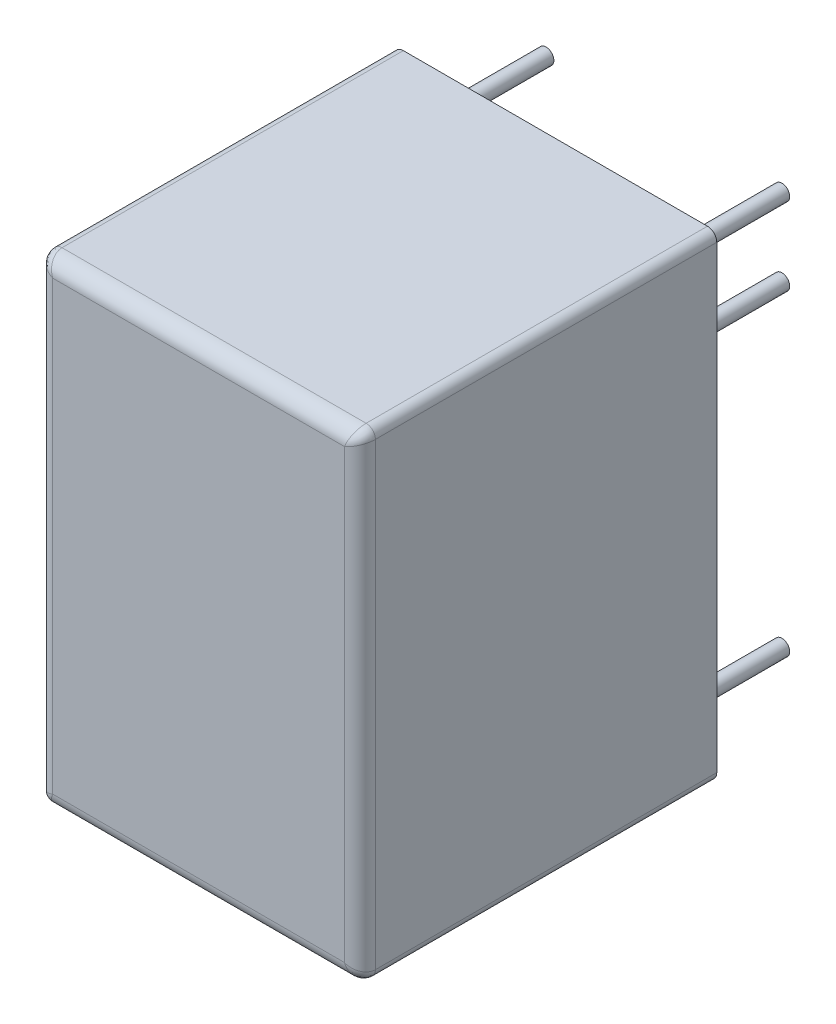
ISO-10303-21;
HEADER;
FILE_DESCRIPTION(('STEP AP214'),'2;1');
FILE_NAME('part.step','',(''),(''),'','','');
FILE_SCHEMA(('AUTOMOTIVE_DESIGN { 1 0 10303 214 1 1 1 1 }'));
ENDSEC;
DATA;
#1=APPLICATION_CONTEXT('core data for automotive mechanical design processes');
#2=APPLICATION_PROTOCOL_DEFINITION('international standard','automotive_design',2000,#1);
#3=PRODUCT_CONTEXT('',#1,'mechanical');
#4=PRODUCT('Part','Part','',(#3));
#5=PRODUCT_RELATED_PRODUCT_CATEGORY('part','',(#4));
#6=PRODUCT_DEFINITION_FORMATION('','',#4);
#7=PRODUCT_DEFINITION_CONTEXT('part definition',#1,'design');
#8=PRODUCT_DEFINITION('design','',#6,#7);
#9=PRODUCT_DEFINITION_SHAPE('','',#8);
#10=(LENGTH_UNIT() NAMED_UNIT(*) SI_UNIT(.MILLI.,.METRE.));
#11=(NAMED_UNIT(*) PLANE_ANGLE_UNIT() SI_UNIT($,.RADIAN.));
#12=(NAMED_UNIT(*) SI_UNIT($,.STERADIAN.) SOLID_ANGLE_UNIT());
#13=UNCERTAINTY_MEASURE_WITH_UNIT(LENGTH_MEASURE(1.E-05),#10,'distance_accuracy_value','');
#14=(GEOMETRIC_REPRESENTATION_CONTEXT(3) GLOBAL_UNCERTAINTY_ASSIGNED_CONTEXT((#13)) GLOBAL_UNIT_ASSIGNED_CONTEXT((#10,
#11,#12)) REPRESENTATION_CONTEXT('',''));
#15=CARTESIAN_POINT('',(0.,0.,0.));
#16=DIRECTION('',(0.,0.,1.));
#17=DIRECTION('',(1.,0.,0.));
#18=AXIS2_PLACEMENT_3D('',#15,#16,#17);
#19=CARTESIAN_POINT('',(27.3,56.6,18.1));
#20=CARTESIAN_POINT('',(27.3,56.6,18.1));
#21=CARTESIAN_POINT('',(27.3,56.6,18.1));
#22=CARTESIAN_POINT('',(27.1687328358683,56.5474931343472,18.1));
#23=CARTESIAN_POINT('',(27.2091570814848,56.5091570814838,18.1000000017816));
#24=CARTESIAN_POINT('',(27.2474931343475,56.468732835868,18.1));
#25=CARTESIAN_POINT('',(27.0390064135073,56.4956025654031,18.0461131946938));
#26=CARTESIAN_POINT('',(27.1079635319146,56.4079635319148,18.0810188700615));
#27=CARTESIAN_POINT('',(27.1956025654029,56.3390064135074,18.0461131946939));
#28=CARTESIAN_POINT('',(26.8538868053063,56.4215547221224,17.8609935864928));
#29=CARTESIAN_POINT('',(26.9089872650397,56.2089872650394,17.9566567342225));
#30=CARTESIAN_POINT('',(27.1215547221225,56.1538868053061,17.8609935864926));
#31=CARTESIAN_POINT('',(26.8,56.4000000016405,17.7312671641272));
#32=CARTESIAN_POINT('',(26.8000001226366,56.1000001226384,17.8292099083742));
#33=CARTESIAN_POINT('',(27.1000000016408,56.1,17.7312671641273));
#34=CARTESIAN_POINT('',(26.8,56.4,17.6));
#35=CARTESIAN_POINT('',(26.8,56.1,17.6));
#36=CARTESIAN_POINT('',(27.1,56.1,17.6));
#37=(BOUNDED_SURFACE() B_SPLINE_SURFACE(3,2,((#19,#20,#21),(#22,#23,#24),(#25,#26,#27),(#28,#29,
#30),(#31,#32,#33),(#34,#35,#36)),.UNSPECIFIED.,.F.,.F.,.F.) B_SPLINE_SURFACE_WITH_KNOTS((4,2,
4),(3,3),(0.,0.5,1.),(0.,1.),
.UNSPECIFIED.) GEOMETRIC_REPRESENTATION_ITEM() RATIONAL_B_SPLINE_SURFACE(((1.,1.,1.),(1.,
1.00267605951747,1.),(1.,0.941599607549783,1.),(1.,0.790451200019097,1.),(1.,0.704674357957136,
1.),(1.,0.707106781186548,1.))) REPRESENTATION_ITEM('') SURFACE());
#38=CARTESIAN_POINT('',(27.1,56.1,17.6));
#39=CARTESIAN_POINT('',(27.1000000016408,56.1,17.7312671641273));
#40=CARTESIAN_POINT('',(27.1215547221225,56.1538868053061,17.8609935864926));
#41=CARTESIAN_POINT('',(27.1956025654029,56.3390064135074,18.0461131946939));
#42=CARTESIAN_POINT('',(27.2474931343475,56.468732835868,18.1));
#43=CARTESIAN_POINT('',(27.3,56.6,18.1));
#44=(BOUNDED_CURVE() B_SPLINE_CURVE(3,(#38,#39,#40,#41,#42,#43),.UNSPECIFIED.,.F.,
.F.) B_SPLINE_CURVE_WITH_KNOTS((4,2,4),(0.,0.5,1.),
.UNSPECIFIED.) CURVE() GEOMETRIC_REPRESENTATION_ITEM() RATIONAL_B_SPLINE_CURVE((1.,1.,1.,1.,1.,1.)) REPRESENTATION_ITEM(''));
#45=CARTESIAN_POINT('',(27.3,56.6,18.1));
#46=VERTEX_POINT('',#45);
#47=CARTESIAN_POINT('',(27.1,56.1,17.6));
#48=VERTEX_POINT('',#47);
#49=EDGE_CURVE('E374',#46,#48,#44,.F.);
#50=CARTESIAN_POINT('',(27.3,56.6,18.1));
#51=CARTESIAN_POINT('',(27.1687328358683,56.5474931343472,18.1));
#52=CARTESIAN_POINT('',(27.0390064135073,56.4956025654031,18.0461131946938));
#53=CARTESIAN_POINT('',(26.8538868053063,56.4215547221224,17.8609935864928));
#54=CARTESIAN_POINT('',(26.8,56.4000000016405,17.7312671641272));
#55=CARTESIAN_POINT('',(26.8,56.4,17.6));
#56=(BOUNDED_CURVE() B_SPLINE_CURVE(3,(#50,#51,#52,#53,#54,#55),.UNSPECIFIED.,.F.,
.F.) B_SPLINE_CURVE_WITH_KNOTS((4,2,4),(0.,0.5,1.),
.UNSPECIFIED.) CURVE() GEOMETRIC_REPRESENTATION_ITEM() RATIONAL_B_SPLINE_CURVE((1.,1.,1.,1.,1.,1.)) REPRESENTATION_ITEM(''));
#57=CARTESIAN_POINT('',(26.8,56.4,17.6));
#58=VERTEX_POINT('',#57);
#59=EDGE_CURVE('E335',#58,#46,#56,.F.);
#60=CARTESIAN_POINT('',(27.1,56.4,17.6));
#61=DIRECTION('',(0.,0.,-1.));
#62=DIRECTION('',(-1.,0.,0.));
#63=AXIS2_PLACEMENT_3D('',#60,#61,#62);
#64=CIRCLE('',#63,0.3);
#65=EDGE_CURVE('E81',#48,#58,#64,.T.);
#66=ORIENTED_EDGE('',*,*,#49,.F.);
#67=ORIENTED_EDGE('',*,*,#59,.F.);
#68=ORIENTED_EDGE('',*,*,#65,.F.);
#69=EDGE_LOOP('',(#66,#67,#68));
#70=FACE_BOUND('',#69,.T.);
#71=ADVANCED_FACE('F17',(#70),#37,.T.);
#72=CARTESIAN_POINT('',(27.3,71.,18.1));
#73=CARTESIAN_POINT('',(27.3,71.,18.1));
#74=CARTESIAN_POINT('',(27.3,71.,18.1));
#75=CARTESIAN_POINT('',(27.2474931343467,71.1312671641314,18.1));
#76=CARTESIAN_POINT('',(27.2091570814853,71.0908429185117,18.1000000019273));
#77=CARTESIAN_POINT('',(27.1687328358679,71.0525068656517,18.1));
#78=CARTESIAN_POINT('',(27.1956025654029,71.260993586493,18.0461131946936));
#79=CARTESIAN_POINT('',(27.1079635319148,71.192036468086,18.0810188700615));
#80=CARTESIAN_POINT('',(27.0390064135073,71.1043974345972,18.0461131946938));
#81=CARTESIAN_POINT('',(27.1215547221225,71.4461131946936,17.860993586493));
#82=CARTESIAN_POINT('',(26.9089872650396,71.3910127349596,17.9566567342225));
#83=CARTESIAN_POINT('',(26.8538868053063,71.1784452778774,17.8609935864928));
#84=CARTESIAN_POINT('',(27.1000000016408,71.5,17.731267164127));
#85=CARTESIAN_POINT('',(26.8000001226376,71.4999998773634,17.8292099083742));
#86=CARTESIAN_POINT('',(26.8,71.199999998359,17.7312671641272));
#87=CARTESIAN_POINT('',(27.1,71.5,17.6));
#88=CARTESIAN_POINT('',(26.8,71.5,17.6));
#89=CARTESIAN_POINT('',(26.8,71.2,17.6));
#90=(BOUNDED_SURFACE() B_SPLINE_SURFACE(3,2,((#72,#73,#74),(#75,#76,#77),(#78,#79,#80),(#81,#82,
#83),(#84,#85,#86),(#87,#88,#89)),.UNSPECIFIED.,.F.,.F.,.F.) B_SPLINE_SURFACE_WITH_KNOTS((4,2,
4),(3,3),(0.,0.5,1.),(0.,1.),
.UNSPECIFIED.) GEOMETRIC_REPRESENTATION_ITEM() RATIONAL_B_SPLINE_SURFACE(((1.,1.,1.),(1.,
1.00267605951761,1.),(1.,0.941599607549592,1.),(1.,0.790451200019283,1.),(1.,0.704674357956987,
1.),(1.,0.707106781186548,1.))) REPRESENTATION_ITEM('') SURFACE());
#91=CARTESIAN_POINT('',(27.1,71.2,17.6));
#92=DIRECTION('',(0.,0.,-1.));
#93=DIRECTION('',(-1.,0.,0.));
#94=AXIS2_PLACEMENT_3D('',#91,#92,#93);
#95=CIRCLE('',#94,0.3);
#96=CARTESIAN_POINT('',(26.8,71.2,17.6));
#97=VERTEX_POINT('',#96);
#98=CARTESIAN_POINT('',(27.1,71.5,17.6));
#99=VERTEX_POINT('',#98);
#100=EDGE_CURVE('E326',#97,#99,#95,.T.);
#101=CARTESIAN_POINT('',(26.8,71.2,17.6));
#102=CARTESIAN_POINT('',(26.8,71.199999998359,17.7312671641272));
#103=CARTESIAN_POINT('',(26.8538868053063,71.1784452778774,17.8609935864928));
#104=CARTESIAN_POINT('',(27.0390064135073,71.1043974345972,18.0461131946938));
#105=CARTESIAN_POINT('',(27.1687328358679,71.0525068656517,18.1));
#106=CARTESIAN_POINT('',(27.3,71.,18.1));
#107=(BOUNDED_CURVE() B_SPLINE_CURVE(3,(#101,#102,#103,#104,#105,#106),.UNSPECIFIED.,.F.,
.F.) B_SPLINE_CURVE_WITH_KNOTS((4,2,4),(0.,0.5,1.),
.UNSPECIFIED.) CURVE() GEOMETRIC_REPRESENTATION_ITEM() RATIONAL_B_SPLINE_CURVE((1.,1.,1.,1.,1.,1.)) REPRESENTATION_ITEM(''));
#108=CARTESIAN_POINT('',(27.3,71.,18.1));
#109=VERTEX_POINT('',#108);
#110=EDGE_CURVE('E80',#109,#97,#107,.F.);
#111=CARTESIAN_POINT('',(27.3,71.,18.1));
#112=CARTESIAN_POINT('',(27.2474931343467,71.1312671641314,18.1));
#113=CARTESIAN_POINT('',(27.1956025654029,71.260993586493,18.0461131946936));
#114=CARTESIAN_POINT('',(27.1215547221225,71.4461131946936,17.860993586493));
#115=CARTESIAN_POINT('',(27.1000000016408,71.5,17.731267164127));
#116=CARTESIAN_POINT('',(27.1,71.5,17.6));
#117=(BOUNDED_CURVE() B_SPLINE_CURVE(3,(#111,#112,#113,#114,#115,#116),.UNSPECIFIED.,.F.,
.F.) B_SPLINE_CURVE_WITH_KNOTS((4,2,4),(0.,0.5,1.),
.UNSPECIFIED.) CURVE() GEOMETRIC_REPRESENTATION_ITEM() RATIONAL_B_SPLINE_CURVE((1.,1.,1.,1.,1.,1.)) REPRESENTATION_ITEM(''));
#118=EDGE_CURVE('E483',#99,#109,#117,.F.);
#119=ORIENTED_EDGE('',*,*,#100,.F.);
#120=ORIENTED_EDGE('',*,*,#110,.F.);
#121=ORIENTED_EDGE('',*,*,#118,.F.);
#122=EDGE_LOOP('',(#119,#120,#121));
#123=FACE_BOUND('',#122,.T.);
#124=ADVANCED_FACE('F413',(#123),#90,.T.);
#125=CARTESIAN_POINT('',(28.2,67.65,3.1));
#126=DIRECTION('',(0.,0.,-1.));
#127=DIRECTION('',(-1.,0.,0.));
#128=AXIS2_PLACEMENT_3D('',#125,#126,#127);
#129=PLANE('',#128);
#130=CARTESIAN_POINT('',(28.2,67.65,3.1));
#131=DIRECTION('',(0.,0.,1.));
#132=DIRECTION('',(1.,0.,0.));
#133=AXIS2_PLACEMENT_3D('',#130,#131,#132);
#134=CIRCLE('',#133,0.25);
#135=CARTESIAN_POINT('',(28.45,67.65,3.1));
#136=VERTEX_POINT('',#135);
#137=EDGE_CURVE('E481',#136,#136,#134,.T.);
#138=ORIENTED_EDGE('',*,*,#137,.F.);
#139=EDGE_LOOP('',(#138));
#140=FACE_BOUND('',#139,.T.);
#141=ADVANCED_FACE('F410',(#140),#129,.T.);
#142=CARTESIAN_POINT('',(28.2,57.45,3.1));
#143=DIRECTION('',(0.,0.,1.));
#144=DIRECTION('',(1.,0.,0.));
#145=AXIS2_PLACEMENT_3D('',#142,#143,#144);
#146=PLANE('',#145);
#147=CARTESIAN_POINT('',(28.2,57.45,3.1));
#148=DIRECTION('',(0.,0.,1.));
#149=DIRECTION('',(1.,0.,0.));
#150=AXIS2_PLACEMENT_3D('',#147,#148,#149);
#151=CIRCLE('',#150,0.25);
#152=CARTESIAN_POINT('',(28.45,57.45,3.1));
#153=VERTEX_POINT('',#152);
#154=EDGE_CURVE('E478',#153,#153,#151,.T.);
#155=ORIENTED_EDGE('',*,*,#154,.F.);
#156=EDGE_LOOP('',(#155));
#157=FACE_BOUND('',#156,.T.);
#158=ADVANCED_FACE('F406',(#157),#146,.F.);
#159=CARTESIAN_POINT('',(35.8,70.15,3.1));
#160=DIRECTION('',(0.,0.,1.));
#161=DIRECTION('',(1.,0.,0.));
#162=AXIS2_PLACEMENT_3D('',#159,#160,#161);
#163=PLANE('',#162);
#164=CARTESIAN_POINT('',(35.8,70.15,3.1));
#165=DIRECTION('',(0.,0.,1.));
#166=DIRECTION('',(1.,0.,0.));
#167=AXIS2_PLACEMENT_3D('',#164,#165,#166);
#168=CIRCLE('',#167,0.25);
#169=CARTESIAN_POINT('',(36.05,70.15,3.1));
#170=VERTEX_POINT('',#169);
#171=EDGE_CURVE('E197',#170,#170,#168,.T.);
#172=ORIENTED_EDGE('',*,*,#171,.F.);
#173=EDGE_LOOP('',(#172));
#174=FACE_BOUND('',#173,.T.);
#175=ADVANCED_FACE('F395',(#174),#163,.F.);
#176=CARTESIAN_POINT('',(37.1999999999999,56.6,17.6));
#177=DIRECTION('',(1.,0.,0.));
#178=DIRECTION('',(0.,0.,-1.));
#179=AXIS2_PLACEMENT_3D('',#176,#177,#178);
#180=CYLINDRICAL_SURFACE('',#179,0.5);
#181=ORIENTED_EDGE('',*,*,#49,.T.);
#182=DIRECTION('',(1.,0.,0.));
#183=VECTOR('',#182,1.);
#184=CARTESIAN_POINT('',(37.1999999999999,56.1,17.6));
#185=LINE('',#184,#183);
#186=CARTESIAN_POINT('',(36.9,56.1,17.6));
#187=VERTEX_POINT('',#186);
#188=EDGE_CURVE('E87',#187,#48,#185,.F.);
#189=ORIENTED_EDGE('',*,*,#188,.F.);
#190=CARTESIAN_POINT('',(36.6999999999999,56.6,18.1));
#191=CARTESIAN_POINT('',(36.7525068656526,56.4687328358681,18.1));
#192=CARTESIAN_POINT('',(36.8043974345969,56.3390064135074,18.0461131946939));
#193=CARTESIAN_POINT('',(36.8784452778776,56.1538868053061,17.8609935864926));
#194=CARTESIAN_POINT('',(36.8999999983595,56.1,17.7312671641273));
#195=CARTESIAN_POINT('',(36.8999999999999,56.1,17.6));
#196=(BOUNDED_CURVE() B_SPLINE_CURVE(3,(#190,#191,#192,#193,#194,#195),.UNSPECIFIED.,.F.,
.F.) B_SPLINE_CURVE_WITH_KNOTS((4,2,4),(0.,0.5,1.),
.UNSPECIFIED.) CURVE() GEOMETRIC_REPRESENTATION_ITEM() RATIONAL_B_SPLINE_CURVE((1.,1.,1.,1.,1.,1.)) REPRESENTATION_ITEM(''));
#197=CARTESIAN_POINT('',(36.6999999999999,56.6,18.1));
#198=VERTEX_POINT('',#197);
#199=EDGE_CURVE('E247',#198,#187,#196,.T.);
#200=ORIENTED_EDGE('',*,*,#199,.F.);
#201=DIRECTION('',(-1.,0.,0.));
#202=VECTOR('',#201,1.);
#203=CARTESIAN_POINT('',(-67.3056104120099,56.6,18.1));
#204=LINE('',#203,#202);
#205=EDGE_CURVE('E248',#198,#46,#204,.T.);
#206=ORIENTED_EDGE('',*,*,#205,.T.);
#207=EDGE_LOOP('',(#181,#189,#200,#206));
#208=FACE_BOUND('',#207,.T.);
#209=ADVANCED_FACE('F386',(#208),#180,.T.);
#210=CARTESIAN_POINT('',(27.1,56.4,18.1));
#211=DIRECTION('',(0.,0.,-1.));
#212=DIRECTION('',(-1.,0.,0.));
#213=AXIS2_PLACEMENT_3D('',#210,#211,#212);
#214=CYLINDRICAL_SURFACE('',#213,0.3);
#215=DIRECTION('',(0.,0.,1.));
#216=VECTOR('',#215,1.);
#217=CARTESIAN_POINT('',(26.8,56.4,18.1));
#218=LINE('',#217,#216);
#219=CARTESIAN_POINT('',(26.8,56.4,6.6));
#220=VERTEX_POINT('',#219);
#221=EDGE_CURVE('E78',#220,#58,#218,.T.);
#222=ORIENTED_EDGE('',*,*,#221,.F.);
#223=CARTESIAN_POINT('',(27.1,56.4,6.6));
#224=DIRECTION('',(0.,0.,-1.));
#225=DIRECTION('',(-1.,0.,0.));
#226=AXIS2_PLACEMENT_3D('',#223,#224,#225);
#227=CIRCLE('',#226,0.3);
#228=CARTESIAN_POINT('',(27.1,56.1,6.6));
#229=VERTEX_POINT('',#228);
#230=EDGE_CURVE('E23',#220,#229,#227,.F.);
#231=ORIENTED_EDGE('',*,*,#230,.T.);
#232=DIRECTION('',(0.,0.,-1.));
#233=VECTOR('',#232,1.);
#234=CARTESIAN_POINT('',(27.1,56.1,18.1));
#235=LINE('',#234,#233);
#236=EDGE_CURVE('E75',#48,#229,#235,.T.);
#237=ORIENTED_EDGE('',*,*,#236,.F.);
#238=ORIENTED_EDGE('',*,*,#65,.T.);
#239=EDGE_LOOP('',(#222,#231,#237,#238));
#240=FACE_BOUND('',#239,.T.);
#241=ADVANCED_FACE('F72',(#240),#214,.T.);
#242=CARTESIAN_POINT('',(27.3,56.1,17.6));
#243=DIRECTION('',(0.,-1.,0.));
#244=DIRECTION('',(0.,0.,-1.));
#245=AXIS2_PLACEMENT_3D('',#242,#243,#244);
#246=CYLINDRICAL_SURFACE('',#245,0.5);
#247=ORIENTED_EDGE('',*,*,#59,.T.);
#248=DIRECTION('',(0.,1.,0.));
#249=VECTOR('',#248,1.);
#250=CARTESIAN_POINT('',(27.3,22.2202160223951,18.1));
#251=LINE('',#250,#249);
#252=EDGE_CURVE('E239',#46,#109,#251,.T.);
#253=ORIENTED_EDGE('',*,*,#252,.T.);
#254=ORIENTED_EDGE('',*,*,#110,.T.);
#255=DIRECTION('',(0.,1.,0.));
#256=VECTOR('',#255,1.);
#257=CARTESIAN_POINT('',(26.8,56.1,17.6));
#258=LINE('',#257,#256);
#259=EDGE_CURVE('E187',#58,#97,#258,.T.);
#260=ORIENTED_EDGE('',*,*,#259,.F.);
#261=EDGE_LOOP('',(#247,#253,#254,#260));
#262=FACE_BOUND('',#261,.T.);
#263=ADVANCED_FACE('F354',(#262),#246,.T.);
#264=CARTESIAN_POINT('',(27.1,71.2,18.1));
#265=DIRECTION('',(0.,0.,-1.));
#266=DIRECTION('',(-1.,0.,0.));
#267=AXIS2_PLACEMENT_3D('',#264,#265,#266);
#268=CYLINDRICAL_SURFACE('',#267,0.3);
#269=DIRECTION('',(0.,0.,1.));
#270=VECTOR('',#269,1.);
#271=CARTESIAN_POINT('',(27.1,71.5,18.1));
#272=LINE('',#271,#270);
#273=CARTESIAN_POINT('',(27.1,71.5,6.6));
#274=VERTEX_POINT('',#273);
#275=EDGE_CURVE('E179',#274,#99,#272,.T.);
#276=ORIENTED_EDGE('',*,*,#275,.F.);
#277=CARTESIAN_POINT('',(27.1,71.2,6.6));
#278=DIRECTION('',(0.,0.,-1.));
#279=DIRECTION('',(-1.,0.,0.));
#280=AXIS2_PLACEMENT_3D('',#277,#278,#279);
#281=CIRCLE('',#280,0.3);
#282=CARTESIAN_POINT('',(26.8,71.2,6.6));
#283=VERTEX_POINT('',#282);
#284=EDGE_CURVE('E334',#274,#283,#281,.F.);
#285=ORIENTED_EDGE('',*,*,#284,.T.);
#286=DIRECTION('',(0.,0.,1.));
#287=VECTOR('',#286,1.);
#288=CARTESIAN_POINT('',(26.8,71.2,18.1));
#289=LINE('',#288,#287);
#290=EDGE_CURVE('E183',#97,#283,#289,.F.);
#291=ORIENTED_EDGE('',*,*,#290,.F.);
#292=ORIENTED_EDGE('',*,*,#100,.T.);
#293=EDGE_LOOP('',(#276,#285,#291,#292));
#294=FACE_BOUND('',#293,.T.);
#295=ADVANCED_FACE('F320',(#294),#268,.T.);
#296=CARTESIAN_POINT('',(26.8,71.,17.6));
#297=DIRECTION('',(-1.,0.,0.));
#298=DIRECTION('',(0.,0.,1.));
#299=AXIS2_PLACEMENT_3D('',#296,#297,#298);
#300=CYLINDRICAL_SURFACE('',#299,0.5);
#301=ORIENTED_EDGE('',*,*,#118,.T.);
#302=DIRECTION('',(-1.,0.,0.));
#303=VECTOR('',#302,1.);
#304=CARTESIAN_POINT('',(-67.3056104120099,71.,18.1));
#305=LINE('',#304,#303);
#306=CARTESIAN_POINT('',(36.6999999999999,71.,18.1));
#307=VERTEX_POINT('',#306);
#308=EDGE_CURVE('E209',#109,#307,#305,.F.);
#309=ORIENTED_EDGE('',*,*,#308,.T.);
#310=CARTESIAN_POINT('',(36.8999999999999,71.5,17.6));
#311=CARTESIAN_POINT('',(36.8999999983595,71.5,17.731267164127));
#312=CARTESIAN_POINT('',(36.8784452778776,71.4461131946936,17.860993586493));
#313=CARTESIAN_POINT('',(36.8043974345969,71.260993586493,18.0461131946936));
#314=CARTESIAN_POINT('',(36.7525068656534,71.1312671641313,18.1));
#315=CARTESIAN_POINT('',(36.6999999999999,71.,18.1));
#316=(BOUNDED_CURVE() B_SPLINE_CURVE(3,(#310,#311,#312,#313,#314,#315),.UNSPECIFIED.,.F.,
.F.) B_SPLINE_CURVE_WITH_KNOTS((4,2,4),(0.,0.5,1.),
.UNSPECIFIED.) CURVE() GEOMETRIC_REPRESENTATION_ITEM() RATIONAL_B_SPLINE_CURVE((1.,1.,1.,1.,1.,1.)) REPRESENTATION_ITEM(''));
#317=CARTESIAN_POINT('',(36.9,71.5,17.6));
#318=VERTEX_POINT('',#317);
#319=EDGE_CURVE('E256',#318,#307,#316,.T.);
#320=ORIENTED_EDGE('',*,*,#319,.F.);
#321=DIRECTION('',(1.,0.,0.));
#322=VECTOR('',#321,1.);
#323=CARTESIAN_POINT('',(26.8,71.5,17.6));
#324=LINE('',#323,#322);
#325=EDGE_CURVE('E182',#99,#318,#324,.T.);
#326=ORIENTED_EDGE('',*,*,#325,.F.);
#327=EDGE_LOOP('',(#301,#309,#320,#326));
#328=FACE_BOUND('',#327,.T.);
#329=ADVANCED_FACE('F309',(#328),#300,.T.);
#330=CARTESIAN_POINT('',(28.2,70.15,3.1));
#331=DIRECTION('',(0.,0.,1.));
#332=DIRECTION('',(1.,0.,0.));
#333=AXIS2_PLACEMENT_3D('',#330,#331,#332);
#334=PLANE('',#333);
#335=CARTESIAN_POINT('',(28.2,70.15,3.1));
#336=DIRECTION('',(0.,0.,1.));
#337=DIRECTION('',(1.,0.,0.));
#338=AXIS2_PLACEMENT_3D('',#335,#336,#337);
#339=CIRCLE('',#338,0.25);
#340=CARTESIAN_POINT('',(28.45,70.15,3.1));
#341=VERTEX_POINT('',#340);
#342=EDGE_CURVE('E295',#341,#341,#339,.T.);
#343=ORIENTED_EDGE('',*,*,#342,.F.);
#344=EDGE_LOOP('',(#343));
#345=FACE_BOUND('',#344,.T.);
#346=ADVANCED_FACE('F319',(#345),#334,.F.);
#347=CARTESIAN_POINT('',(35.8,57.45,3.1));
#348=DIRECTION('',(0.,0.,1.));
#349=DIRECTION('',(1.,0.,0.));
#350=AXIS2_PLACEMENT_3D('',#347,#348,#349);
#351=PLANE('',#350);
#352=CARTESIAN_POINT('',(35.8,57.45,3.1));
#353=DIRECTION('',(0.,0.,1.));
#354=DIRECTION('',(1.,0.,0.));
#355=AXIS2_PLACEMENT_3D('',#352,#353,#354);
#356=CIRCLE('',#355,0.25);
#357=CARTESIAN_POINT('',(36.05,57.45,3.1));
#358=VERTEX_POINT('',#357);
#359=EDGE_CURVE('E471',#358,#358,#356,.T.);
#360=ORIENTED_EDGE('',*,*,#359,.F.);
#361=EDGE_LOOP('',(#360));
#362=FACE_BOUND('',#361,.T.);
#363=ADVANCED_FACE('F576',(#362),#351,.F.);
#364=CARTESIAN_POINT('',(35.8,67.65,3.1));
#365=DIRECTION('',(0.,0.,1.));
#366=DIRECTION('',(1.,0.,0.));
#367=AXIS2_PLACEMENT_3D('',#364,#365,#366);
#368=PLANE('',#367);
#369=CARTESIAN_POINT('',(35.8,67.65,3.1));
#370=DIRECTION('',(0.,0.,1.));
#371=DIRECTION('',(1.,0.,0.));
#372=AXIS2_PLACEMENT_3D('',#369,#370,#371);
#373=CIRCLE('',#372,0.25);
#374=CARTESIAN_POINT('',(36.05,67.65,3.1));
#375=VERTEX_POINT('',#374);
#376=EDGE_CURVE('E176',#375,#375,#373,.T.);
#377=ORIENTED_EDGE('',*,*,#376,.F.);
#378=EDGE_LOOP('',(#377));
#379=FACE_BOUND('',#378,.T.);
#380=ADVANCED_FACE('F274',(#379),#368,.F.);
#381=CARTESIAN_POINT('',(36.6999999999999,71.,18.1));
#382=CARTESIAN_POINT('',(36.6999999999999,71.,18.1));
#383=CARTESIAN_POINT('',(36.6999999999999,71.,18.1));
#384=CARTESIAN_POINT('',(36.8312671641323,71.0525068656515,18.1));
#385=CARTESIAN_POINT('',(36.7908429185151,71.0908429185113,18.1000000019273));
#386=CARTESIAN_POINT('',(36.7525068656534,71.1312671641313,18.1));
#387=CARTESIAN_POINT('',(36.9609935864925,71.1043974345972,18.0461131946939));
#388=CARTESIAN_POINT('',(36.8920364680851,71.192036468086,18.0810188700616));
#389=CARTESIAN_POINT('',(36.8043974345969,71.260993586493,18.0461131946936));
#390=CARTESIAN_POINT('',(37.1461131946939,71.1784452778774,17.8609935864926));
#391=CARTESIAN_POINT('',(37.0910127349605,71.3910127349596,17.9566567342223));
#392=CARTESIAN_POINT('',(36.8784452778776,71.4461131946936,17.860993586493));
#393=CARTESIAN_POINT('',(37.1999999999999,71.199999998359,17.7312671641273));
#394=CARTESIAN_POINT('',(37.1999998773616,71.4999998773634,17.8292099083743));
#395=CARTESIAN_POINT('',(36.8999999983595,71.5,17.731267164127));
#396=CARTESIAN_POINT('',(37.1999999999999,71.2,17.6));
#397=CARTESIAN_POINT('',(37.1999999999999,71.5,17.6));
#398=CARTESIAN_POINT('',(36.8999999999999,71.5,17.6));
#399=(BOUNDED_SURFACE() B_SPLINE_SURFACE(3,2,((#381,#382,#383),(#384,#385,#386),(#387,#388,
#389),(#390,#391,#392),(#393,#394,#395),(#396,#397,#398)),.UNSPECIFIED.,.F.,.F.,
.F.) B_SPLINE_SURFACE_WITH_KNOTS((4,2,4),(3,3),(0.,0.5,1.),(0.,1.),
.UNSPECIFIED.) GEOMETRIC_REPRESENTATION_ITEM() RATIONAL_B_SPLINE_SURFACE(((1.,1.,1.),(1.,
1.00267605951755,1.),(1.,0.94159960754967,1.),(1.,0.790451200019212,1.),(1.,0.704674357957034,
1.),(1.,0.707106781186548,1.))) REPRESENTATION_ITEM('') SURFACE());
#400=CARTESIAN_POINT('',(36.9,71.2,17.6));
#401=DIRECTION('',(0.,0.,-1.));
#402=DIRECTION('',(-1.,0.,0.));
#403=AXIS2_PLACEMENT_3D('',#400,#401,#402);
#404=CIRCLE('',#403,0.3);
#405=CARTESIAN_POINT('',(37.1999999999999,71.2,17.6));
#406=VERTEX_POINT('',#405);
#407=EDGE_CURVE('E164',#318,#406,#404,.T.);
#408=CARTESIAN_POINT('',(36.6999999999999,71.,18.1));
#409=CARTESIAN_POINT('',(36.8312671641323,71.0525068656515,18.1));
#410=CARTESIAN_POINT('',(36.9609935864925,71.1043974345972,18.0461131946939));
#411=CARTESIAN_POINT('',(37.1461131946939,71.1784452778774,17.8609935864926));
#412=CARTESIAN_POINT('',(37.1999999999999,71.199999998359,17.7312671641273));
#413=CARTESIAN_POINT('',(37.1999999999999,71.2,17.6));
#414=(BOUNDED_CURVE() B_SPLINE_CURVE(3,(#408,#409,#410,#411,#412,#413),.UNSPECIFIED.,.F.,
.F.) B_SPLINE_CURVE_WITH_KNOTS((4,2,4),(0.,0.5,1.),
.UNSPECIFIED.) CURVE() GEOMETRIC_REPRESENTATION_ITEM() RATIONAL_B_SPLINE_CURVE((1.,1.,1.,1.,1.,1.)) REPRESENTATION_ITEM(''));
#415=EDGE_CURVE('E130',#406,#307,#414,.F.);
#416=ORIENTED_EDGE('',*,*,#407,.F.);
#417=ORIENTED_EDGE('',*,*,#319,.T.);
#418=ORIENTED_EDGE('',*,*,#415,.F.);
#419=EDGE_LOOP('',(#416,#417,#418));
#420=FACE_BOUND('',#419,.T.);
#421=ADVANCED_FACE('F263',(#420),#399,.T.);
#422=CARTESIAN_POINT('',(-67.3056104120099,22.2202160223951,18.1));
#423=DIRECTION('',(0.,0.,-1.));
#424=DIRECTION('',(-1.,0.,0.));
#425=AXIS2_PLACEMENT_3D('',#422,#423,#424);
#426=PLANE('',#425);
#427=ORIENTED_EDGE('',*,*,#205,.F.);
#428=DIRECTION('',(0.,1.,0.));
#429=VECTOR('',#428,1.);
#430=CARTESIAN_POINT('',(36.6999999999999,71.5,18.1));
#431=LINE('',#430,#429);
#432=EDGE_CURVE('E155',#307,#198,#431,.F.);
#433=ORIENTED_EDGE('',*,*,#432,.F.);
#434=ORIENTED_EDGE('',*,*,#308,.F.);
#435=ORIENTED_EDGE('',*,*,#252,.F.);
#436=EDGE_LOOP('',(#427,#433,#434,#435));
#437=FACE_BOUND('',#436,.T.);
#438=ADVANCED_FACE('F224',(#437),#426,.F.);
#439=CARTESIAN_POINT('',(36.6999999999999,56.6,18.1));
#440=CARTESIAN_POINT('',(36.6999999999999,56.6,18.1));
#441=CARTESIAN_POINT('',(36.6999999999999,56.6,18.1));
#442=CARTESIAN_POINT('',(36.7525068656526,56.4687328358681,18.1));
#443=CARTESIAN_POINT('',(36.7908429185158,56.5091570814842,18.1000000017816));
#444=CARTESIAN_POINT('',(36.8312671641319,56.5474931343474,18.1));
#445=CARTESIAN_POINT('',(36.8043974345969,56.3390064135074,18.0461131946939));
#446=CARTESIAN_POINT('',(36.8920364680852,56.4079635319148,18.0810188700615));
#447=CARTESIAN_POINT('',(36.9609935864925,56.4956025654031,18.0461131946939));
#448=CARTESIAN_POINT('',(36.8784452778776,56.1538868053061,17.8609935864926));
#449=CARTESIAN_POINT('',(37.0910127349606,56.2089872650394,17.9566567342224));
#450=CARTESIAN_POINT('',(37.1461131946939,56.4215547221224,17.8609935864926));
#451=CARTESIAN_POINT('',(36.8999999983595,56.1,17.7312671641273));
#452=CARTESIAN_POINT('',(37.1999998773626,56.1000001226384,17.8292099083741));
#453=CARTESIAN_POINT('',(37.1999999999999,56.4000000016405,17.7312671641273));
#454=CARTESIAN_POINT('',(36.8999999999999,56.1,17.6));
#455=CARTESIAN_POINT('',(37.1999999999999,56.1,17.6));
#456=CARTESIAN_POINT('',(37.1999999999999,56.4,17.6));
#457=(BOUNDED_SURFACE() B_SPLINE_SURFACE(3,2,((#439,#440,#441),(#442,#443,#444),(#445,#446,
#447),(#448,#449,#450),(#451,#452,#453),(#454,#455,#456)),.UNSPECIFIED.,.F.,.F.,
.F.) B_SPLINE_SURFACE_WITH_KNOTS((4,2,4),(3,3),(0.,0.5,1.),(0.,1.),
.UNSPECIFIED.) GEOMETRIC_REPRESENTATION_ITEM() RATIONAL_B_SPLINE_SURFACE(((1.,1.,1.),(1.,
1.00267605951741,1.),(1.,0.941599607549861,1.),(1.,0.790451200019025,1.),(1.,0.704674357957183,
1.),(1.,0.707106781186548,1.))) REPRESENTATION_ITEM('') SURFACE());
#458=CARTESIAN_POINT('',(37.1999999999999,56.4,17.6));
#459=CARTESIAN_POINT('',(37.1999999999999,56.4000000016405,17.7312671641273));
#460=CARTESIAN_POINT('',(37.1461131946939,56.4215547221224,17.8609935864926));
#461=CARTESIAN_POINT('',(36.9609935864925,56.4956025654031,18.0461131946939));
#462=CARTESIAN_POINT('',(36.8312671641319,56.5474931343474,18.1));
#463=CARTESIAN_POINT('',(36.6999999999999,56.6,18.1));
#464=(BOUNDED_CURVE() B_SPLINE_CURVE(3,(#458,#459,#460,#461,#462,#463),.UNSPECIFIED.,.F.,
.F.) B_SPLINE_CURVE_WITH_KNOTS((4,2,4),(0.,0.5,1.),
.UNSPECIFIED.) CURVE() GEOMETRIC_REPRESENTATION_ITEM() RATIONAL_B_SPLINE_CURVE((1.,1.,1.,1.,1.,1.)) REPRESENTATION_ITEM(''));
#465=CARTESIAN_POINT('',(37.1999999999999,56.4,17.6));
#466=VERTEX_POINT('',#465);
#467=EDGE_CURVE('E116',#198,#466,#464,.F.);
#468=CARTESIAN_POINT('',(36.9,56.4,17.6));
#469=DIRECTION('',(0.,0.,-1.));
#470=DIRECTION('',(-1.,0.,0.));
#471=AXIS2_PLACEMENT_3D('',#468,#469,#470);
#472=CIRCLE('',#471,0.3);
#473=EDGE_CURVE('E112',#466,#187,#472,.T.);
#474=ORIENTED_EDGE('',*,*,#467,.F.);
#475=ORIENTED_EDGE('',*,*,#199,.T.);
#476=ORIENTED_EDGE('',*,*,#473,.F.);
#477=EDGE_LOOP('',(#474,#475,#476));
#478=FACE_BOUND('',#477,.T.);
#479=ADVANCED_FACE('F211',(#478),#457,.T.);
#480=CARTESIAN_POINT('',(28.2,67.65,3.1));
#481=DIRECTION('',(0.,0.,1.));
#482=DIRECTION('',(1.,0.,0.));
#483=AXIS2_PLACEMENT_3D('',#480,#481,#482);
#484=CYLINDRICAL_SURFACE('',#483,0.25);
#485=CARTESIAN_POINT('',(28.2,67.65,6.6));
#486=DIRECTION('',(0.,0.,1.));
#487=DIRECTION('',(1.,0.,0.));
#488=AXIS2_PLACEMENT_3D('',#485,#486,#487);
#489=CIRCLE('',#488,0.25);
#490=CARTESIAN_POINT('',(28.45,67.65,6.6));
#491=VERTEX_POINT('',#490);
#492=EDGE_CURVE('E171',#491,#491,#489,.T.);
#493=ORIENTED_EDGE('',*,*,#492,.F.);
#494=EDGE_LOOP('',(#493));
#495=FACE_BOUND('',#494,.T.);
#496=ORIENTED_EDGE('',*,*,#137,.T.);
#497=EDGE_LOOP('',(#496));
#498=FACE_BOUND('',#497,.T.);
#499=ADVANCED_FACE('F223',(#495,#498),#484,.T.);
#500=CARTESIAN_POINT('',(28.2,57.45,3.1));
#501=DIRECTION('',(0.,0.,1.));
#502=DIRECTION('',(1.,0.,0.));
#503=AXIS2_PLACEMENT_3D('',#500,#501,#502);
#504=CYLINDRICAL_SURFACE('',#503,0.25);
#505=CARTESIAN_POINT('',(28.2,57.45,6.6));
#506=DIRECTION('',(0.,0.,1.));
#507=DIRECTION('',(1.,0.,0.));
#508=AXIS2_PLACEMENT_3D('',#505,#506,#507);
#509=CIRCLE('',#508,0.25);
#510=CARTESIAN_POINT('',(28.45,57.45,6.6));
#511=VERTEX_POINT('',#510);
#512=EDGE_CURVE('E97',#511,#511,#509,.T.);
#513=ORIENTED_EDGE('',*,*,#512,.F.);
#514=EDGE_LOOP('',(#513));
#515=FACE_BOUND('',#514,.T.);
#516=ORIENTED_EDGE('',*,*,#154,.T.);
#517=EDGE_LOOP('',(#516));
#518=FACE_BOUND('',#517,.T.);
#519=ADVANCED_FACE('F537',(#515,#518),#504,.T.);
#520=CARTESIAN_POINT('',(35.8,70.15,3.1));
#521=DIRECTION('',(0.,0.,1.));
#522=DIRECTION('',(1.,0.,0.));
#523=AXIS2_PLACEMENT_3D('',#520,#521,#522);
#524=CYLINDRICAL_SURFACE('',#523,0.25);
#525=CARTESIAN_POINT('',(35.8,70.15,6.6));
#526=DIRECTION('',(0.,0.,1.));
#527=DIRECTION('',(1.,0.,0.));
#528=AXIS2_PLACEMENT_3D('',#525,#526,#527);
#529=CIRCLE('',#528,0.25);
#530=CARTESIAN_POINT('',(36.05,70.15,6.6));
#531=VERTEX_POINT('',#530);
#532=EDGE_CURVE('E92',#531,#531,#529,.T.);
#533=ORIENTED_EDGE('',*,*,#532,.F.);
#534=EDGE_LOOP('',(#533));
#535=FACE_BOUND('',#534,.T.);
#536=ORIENTED_EDGE('',*,*,#171,.T.);
#537=EDGE_LOOP('',(#536));
#538=FACE_BOUND('',#537,.T.);
#539=ADVANCED_FACE('F532',(#535,#538),#524,.T.);
#540=CARTESIAN_POINT('',(37.1999999999999,56.1,18.1));
#541=DIRECTION('',(0.,-1.,0.));
#542=DIRECTION('',(0.,0.,-1.));
#543=AXIS2_PLACEMENT_3D('',#540,#541,#542);
#544=PLANE('',#543);
#545=ORIENTED_EDGE('',*,*,#236,.T.);
#546=DIRECTION('',(-1.,0.,0.));
#547=VECTOR('',#546,1.);
#548=CARTESIAN_POINT('',(-67.3056104120099,56.1,6.6));
#549=LINE('',#548,#547);
#550=CARTESIAN_POINT('',(36.9,56.1,6.6));
#551=VERTEX_POINT('',#550);
#552=EDGE_CURVE('E85',#551,#229,#549,.T.);
#553=ORIENTED_EDGE('',*,*,#552,.F.);
#554=DIRECTION('',(0.,0.,-1.));
#555=VECTOR('',#554,1.);
#556=CARTESIAN_POINT('',(36.9,56.1,18.1));
#557=LINE('',#556,#555);
#558=EDGE_CURVE('E115',#187,#551,#557,.T.);
#559=ORIENTED_EDGE('',*,*,#558,.F.);
#560=ORIENTED_EDGE('',*,*,#188,.T.);
#561=EDGE_LOOP('',(#545,#553,#559,#560));
#562=FACE_BOUND('',#561,.T.);
#563=ADVANCED_FACE('F83',(#562),#544,.T.);
#564=CARTESIAN_POINT('',(26.8,56.1,18.1));
#565=DIRECTION('',(-1.,0.,0.));
#566=DIRECTION('',(0.,0.,1.));
#567=AXIS2_PLACEMENT_3D('',#564,#565,#566);
#568=PLANE('',#567);
#569=ORIENTED_EDGE('',*,*,#290,.T.);
#570=DIRECTION('',(0.,1.,0.));
#571=VECTOR('',#570,1.);
#572=CARTESIAN_POINT('',(26.8,22.2202160223951,6.6));
#573=LINE('',#572,#571);
#574=EDGE_CURVE('E91',#220,#283,#573,.T.);
#575=ORIENTED_EDGE('',*,*,#574,.F.);
#576=ORIENTED_EDGE('',*,*,#221,.T.);
#577=ORIENTED_EDGE('',*,*,#259,.T.);
#578=EDGE_LOOP('',(#569,#575,#576,#577));
#579=FACE_BOUND('',#578,.T.);
#580=ADVANCED_FACE('F523',(#579),#568,.T.);
#581=CARTESIAN_POINT('',(26.8,71.5,18.1));
#582=DIRECTION('',(0.,1.,0.));
#583=DIRECTION('',(0.,0.,1.));
#584=AXIS2_PLACEMENT_3D('',#581,#582,#583);
#585=PLANE('',#584);
#586=DIRECTION('',(0.,0.,-1.));
#587=VECTOR('',#586,1.);
#588=CARTESIAN_POINT('',(36.9,71.5,18.1));
#589=LINE('',#588,#587);
#590=CARTESIAN_POINT('',(36.9,71.5,6.6));
#591=VERTEX_POINT('',#590);
#592=EDGE_CURVE('E167',#591,#318,#589,.F.);
#593=ORIENTED_EDGE('',*,*,#592,.F.);
#594=DIRECTION('',(-1.,0.,0.));
#595=VECTOR('',#594,1.);
#596=CARTESIAN_POINT('',(-67.3056104120099,71.5,6.6));
#597=LINE('',#596,#595);
#598=EDGE_CURVE('E94',#274,#591,#597,.F.);
#599=ORIENTED_EDGE('',*,*,#598,.F.);
#600=ORIENTED_EDGE('',*,*,#275,.T.);
#601=ORIENTED_EDGE('',*,*,#325,.T.);
#602=EDGE_LOOP('',(#593,#599,#600,#601));
#603=FACE_BOUND('',#602,.T.);
#604=ADVANCED_FACE('F519',(#603),#585,.T.);
#605=CARTESIAN_POINT('',(28.2,70.15,3.1));
#606=DIRECTION('',(0.,0.,1.));
#607=DIRECTION('',(1.,0.,0.));
#608=AXIS2_PLACEMENT_3D('',#605,#606,#607);
#609=CYLINDRICAL_SURFACE('',#608,0.25);
#610=CARTESIAN_POINT('',(28.2,70.15,6.6));
#611=DIRECTION('',(0.,0.,1.));
#612=DIRECTION('',(1.,0.,0.));
#613=AXIS2_PLACEMENT_3D('',#610,#611,#612);
#614=CIRCLE('',#613,0.25);
#615=CARTESIAN_POINT('',(28.45,70.15,6.6));
#616=VERTEX_POINT('',#615);
#617=EDGE_CURVE('E458',#616,#616,#614,.T.);
#618=ORIENTED_EDGE('',*,*,#617,.F.);
#619=EDGE_LOOP('',(#618));
#620=FACE_BOUND('',#619,.T.);
#621=ORIENTED_EDGE('',*,*,#342,.T.);
#622=EDGE_LOOP('',(#621));
#623=FACE_BOUND('',#622,.T.);
#624=ADVANCED_FACE('F530',(#620,#623),#609,.T.);
#625=CARTESIAN_POINT('',(35.8,57.45,3.1));
#626=DIRECTION('',(0.,0.,1.));
#627=DIRECTION('',(1.,0.,0.));
#628=AXIS2_PLACEMENT_3D('',#625,#626,#627);
#629=CYLINDRICAL_SURFACE('',#628,0.25);
#630=CARTESIAN_POINT('',(35.8,57.45,6.6));
#631=DIRECTION('',(0.,0.,1.));
#632=DIRECTION('',(1.,0.,0.));
#633=AXIS2_PLACEMENT_3D('',#630,#631,#632);
#634=CIRCLE('',#633,0.25);
#635=CARTESIAN_POINT('',(36.05,57.45,6.6));
#636=VERTEX_POINT('',#635);
#637=EDGE_CURVE('E455',#636,#636,#634,.T.);
#638=ORIENTED_EDGE('',*,*,#637,.F.);
#639=EDGE_LOOP('',(#638));
#640=FACE_BOUND('',#639,.T.);
#641=ORIENTED_EDGE('',*,*,#359,.T.);
#642=EDGE_LOOP('',(#641));
#643=FACE_BOUND('',#642,.T.);
#644=ADVANCED_FACE('F718',(#640,#643),#629,.T.);
#645=CARTESIAN_POINT('',(35.8,67.65,3.1));
#646=DIRECTION('',(0.,0.,1.));
#647=DIRECTION('',(1.,0.,0.));
#648=AXIS2_PLACEMENT_3D('',#645,#646,#647);
#649=CYLINDRICAL_SURFACE('',#648,0.25);
#650=CARTESIAN_POINT('',(35.8,67.65,6.6));
#651=DIRECTION('',(0.,0.,1.));
#652=DIRECTION('',(1.,0.,0.));
#653=AXIS2_PLACEMENT_3D('',#650,#651,#652);
#654=CIRCLE('',#653,0.25);
#655=CARTESIAN_POINT('',(36.05,67.65,6.6));
#656=VERTEX_POINT('',#655);
#657=EDGE_CURVE('E109',#656,#656,#654,.T.);
#658=ORIENTED_EDGE('',*,*,#657,.F.);
#659=EDGE_LOOP('',(#658));
#660=FACE_BOUND('',#659,.T.);
#661=ORIENTED_EDGE('',*,*,#376,.T.);
#662=EDGE_LOOP('',(#661));
#663=FACE_BOUND('',#662,.T.);
#664=ADVANCED_FACE('F725',(#660,#663),#649,.T.);
#665=CARTESIAN_POINT('',(36.9,71.2,18.1));
#666=DIRECTION('',(0.,0.,-1.));
#667=DIRECTION('',(-1.,0.,0.));
#668=AXIS2_PLACEMENT_3D('',#665,#666,#667);
#669=CYLINDRICAL_SURFACE('',#668,0.3);
#670=DIRECTION('',(0.,0.,-1.));
#671=VECTOR('',#670,1.);
#672=CARTESIAN_POINT('',(37.1999999999999,71.2,18.1));
#673=LINE('',#672,#671);
#674=CARTESIAN_POINT('',(37.1999999999999,71.2,6.6));
#675=VERTEX_POINT('',#674);
#676=EDGE_CURVE('E106',#675,#406,#673,.F.);
#677=ORIENTED_EDGE('',*,*,#676,.F.);
#678=CARTESIAN_POINT('',(36.9,71.2,6.6));
#679=DIRECTION('',(0.,0.,-1.));
#680=DIRECTION('',(-1.,0.,0.));
#681=AXIS2_PLACEMENT_3D('',#678,#679,#680);
#682=CIRCLE('',#681,0.3);
#683=EDGE_CURVE('E462',#591,#675,#682,.T.);
#684=ORIENTED_EDGE('',*,*,#683,.F.);
#685=ORIENTED_EDGE('',*,*,#592,.T.);
#686=ORIENTED_EDGE('',*,*,#407,.T.);
#687=EDGE_LOOP('',(#677,#684,#685,#686));
#688=FACE_BOUND('',#687,.T.);
#689=ADVANCED_FACE('F148',(#688),#669,.T.);
#690=CARTESIAN_POINT('',(36.6999999999999,71.5,17.6));
#691=DIRECTION('',(0.,1.,0.));
#692=DIRECTION('',(0.,0.,1.));
#693=AXIS2_PLACEMENT_3D('',#690,#691,#692);
#694=CYLINDRICAL_SURFACE('',#693,0.5);
#695=ORIENTED_EDGE('',*,*,#467,.T.);
#696=DIRECTION('',(0.,1.,0.));
#697=VECTOR('',#696,1.);
#698=CARTESIAN_POINT('',(37.1999999999999,71.5,17.6));
#699=LINE('',#698,#697);
#700=EDGE_CURVE('E103',#406,#466,#699,.F.);
#701=ORIENTED_EDGE('',*,*,#700,.F.);
#702=ORIENTED_EDGE('',*,*,#415,.T.);
#703=ORIENTED_EDGE('',*,*,#432,.T.);
#704=EDGE_LOOP('',(#695,#701,#702,#703));
#705=FACE_BOUND('',#704,.T.);
#706=ADVANCED_FACE('F137',(#705),#694,.T.);
#707=CARTESIAN_POINT('',(36.9,56.4,18.1));
#708=DIRECTION('',(0.,0.,-1.));
#709=DIRECTION('',(-1.,0.,0.));
#710=AXIS2_PLACEMENT_3D('',#707,#708,#709);
#711=CYLINDRICAL_SURFACE('',#710,0.3);
#712=ORIENTED_EDGE('',*,*,#558,.T.);
#713=CARTESIAN_POINT('',(36.9,56.4,6.6));
#714=DIRECTION('',(0.,0.,-1.));
#715=DIRECTION('',(-1.,0.,0.));
#716=AXIS2_PLACEMENT_3D('',#713,#714,#715);
#717=CIRCLE('',#716,0.3);
#718=CARTESIAN_POINT('',(37.1999999999999,56.4,6.6));
#719=VERTEX_POINT('',#718);
#720=EDGE_CURVE('E38',#719,#551,#717,.T.);
#721=ORIENTED_EDGE('',*,*,#720,.F.);
#722=DIRECTION('',(0.,0.,-1.));
#723=VECTOR('',#722,1.);
#724=CARTESIAN_POINT('',(37.1999999999999,56.4,18.1));
#725=LINE('',#724,#723);
#726=EDGE_CURVE('E29',#466,#719,#725,.T.);
#727=ORIENTED_EDGE('',*,*,#726,.F.);
#728=ORIENTED_EDGE('',*,*,#473,.T.);
#729=EDGE_LOOP('',(#712,#721,#727,#728));
#730=FACE_BOUND('',#729,.T.);
#731=ADVANCED_FACE('F147',(#730),#711,.T.);
#732=CARTESIAN_POINT('',(-67.3056104120099,22.2202160223951,6.6));
#733=DIRECTION('',(0.,0.,-1.));
#734=DIRECTION('',(-1.,0.,0.));
#735=AXIS2_PLACEMENT_3D('',#732,#733,#734);
#736=PLANE('',#735);
#737=ORIENTED_EDGE('',*,*,#657,.T.);
#738=EDGE_LOOP('',(#737));
#739=FACE_BOUND('',#738,.T.);
#740=ORIENTED_EDGE('',*,*,#637,.T.);
#741=EDGE_LOOP('',(#740));
#742=FACE_BOUND('',#741,.T.);
#743=ORIENTED_EDGE('',*,*,#617,.T.);
#744=EDGE_LOOP('',(#743));
#745=FACE_BOUND('',#744,.T.);
#746=DIRECTION('',(0.,1.,0.));
#747=VECTOR('',#746,1.);
#748=CARTESIAN_POINT('',(37.1999999999999,71.5,6.6));
#749=LINE('',#748,#747);
#750=EDGE_CURVE('E11',#719,#675,#749,.T.);
#751=ORIENTED_EDGE('',*,*,#750,.F.);
#752=ORIENTED_EDGE('',*,*,#720,.T.);
#753=ORIENTED_EDGE('',*,*,#552,.T.);
#754=ORIENTED_EDGE('',*,*,#230,.F.);
#755=ORIENTED_EDGE('',*,*,#574,.T.);
#756=ORIENTED_EDGE('',*,*,#284,.F.);
#757=ORIENTED_EDGE('',*,*,#598,.T.);
#758=ORIENTED_EDGE('',*,*,#683,.T.);
#759=EDGE_LOOP('',(#751,#752,#753,#754,#755,#756,#757,#758));
#760=FACE_BOUND('',#759,.T.);
#761=ORIENTED_EDGE('',*,*,#532,.T.);
#762=EDGE_LOOP('',(#761));
#763=FACE_BOUND('',#762,.T.);
#764=ORIENTED_EDGE('',*,*,#512,.T.);
#765=EDGE_LOOP('',(#764));
#766=FACE_BOUND('',#765,.T.);
#767=ORIENTED_EDGE('',*,*,#492,.T.);
#768=EDGE_LOOP('',(#767));
#769=FACE_BOUND('',#768,.T.);
#770=ADVANCED_FACE('F89',(#739,#742,#745,#760,#763,#766,#769),#736,.T.);
#771=CARTESIAN_POINT('',(37.1999999999999,71.5,18.1));
#772=DIRECTION('',(1.,0.,0.));
#773=DIRECTION('',(0.,0.,-1.));
#774=AXIS2_PLACEMENT_3D('',#771,#772,#773);
#775=PLANE('',#774);
#776=ORIENTED_EDGE('',*,*,#726,.T.);
#777=ORIENTED_EDGE('',*,*,#750,.T.);
#778=ORIENTED_EDGE('',*,*,#676,.T.);
#779=ORIENTED_EDGE('',*,*,#700,.T.);
#780=EDGE_LOOP('',(#776,#777,#778,#779));
#781=FACE_BOUND('',#780,.T.);
#782=ADVANCED_FACE('F503',(#781),#775,.T.);
#783=CLOSED_SHELL('',(#71,#124,#141,#158,#175,#209,#241,#263,#295,#329,#346,#363,#380,#421,#438,
#479,#499,#519,#539,#563,#580,#604,#624,#644,#664,#689,#706,#731,#770,#782));
#784=MANIFOLD_SOLID_BREP('B1',#783);
#785=ADVANCED_BREP_SHAPE_REPRESENTATION('',(#18,#784),#14);
#786=SHAPE_DEFINITION_REPRESENTATION(#9,#785);
ENDSEC;
END-ISO-10303-21;
